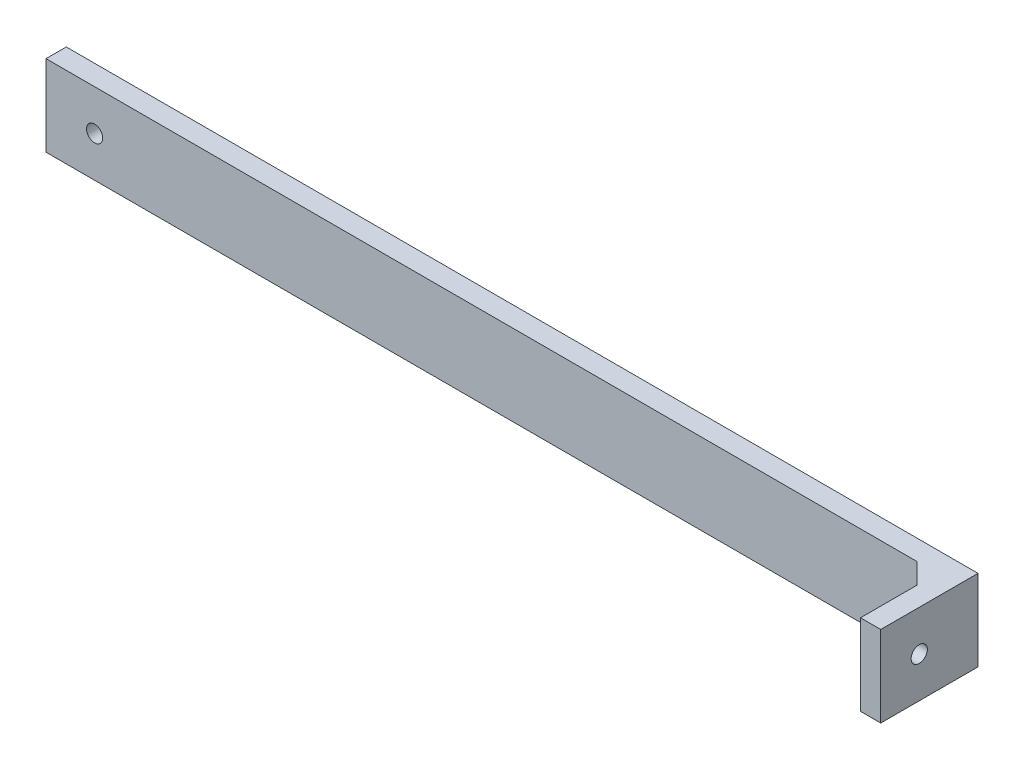
ISO-10303-21;
HEADER;
FILE_DESCRIPTION(('STEP AP214'),'2;1');
FILE_NAME('part.step','',(''),(''),'','','');
FILE_SCHEMA(('AUTOMOTIVE_DESIGN { 1 0 10303 214 1 1 1 1 }'));
ENDSEC;
DATA;
#1=APPLICATION_CONTEXT('core data for automotive mechanical design processes');
#2=APPLICATION_PROTOCOL_DEFINITION('international standard','automotive_design',2000,#1);
#3=PRODUCT_CONTEXT('',#1,'mechanical');
#4=PRODUCT('Part','Part','',(#3));
#5=PRODUCT_RELATED_PRODUCT_CATEGORY('part','',(#4));
#6=PRODUCT_DEFINITION_FORMATION('','',#4);
#7=PRODUCT_DEFINITION_CONTEXT('part definition',#1,'design');
#8=PRODUCT_DEFINITION('design','',#6,#7);
#9=PRODUCT_DEFINITION_SHAPE('','',#8);
#10=(LENGTH_UNIT() NAMED_UNIT(*) SI_UNIT(.MILLI.,.METRE.));
#11=(NAMED_UNIT(*) PLANE_ANGLE_UNIT() SI_UNIT($,.RADIAN.));
#12=(NAMED_UNIT(*) SI_UNIT($,.STERADIAN.) SOLID_ANGLE_UNIT());
#13=UNCERTAINTY_MEASURE_WITH_UNIT(LENGTH_MEASURE(1.E-05),#10,'distance_accuracy_value','');
#14=(GEOMETRIC_REPRESENTATION_CONTEXT(3) GLOBAL_UNCERTAINTY_ASSIGNED_CONTEXT((#13)) GLOBAL_UNIT_ASSIGNED_CONTEXT((#10,
#11,#12)) REPRESENTATION_CONTEXT('',''));
#15=CARTESIAN_POINT('',(0.,0.,0.));
#16=DIRECTION('',(0.,0.,1.));
#17=DIRECTION('',(1.,0.,0.));
#18=AXIS2_PLACEMENT_3D('',#15,#16,#17);
#19=CARTESIAN_POINT('',(0.,0.,5.));
#20=DIRECTION('',(0.,0.,-1.));
#21=DIRECTION('',(-1.,0.,0.));
#22=AXIS2_PLACEMENT_3D('',#19,#20,#21);
#23=PLANE('',#22);
#24=CARTESIAN_POINT('',(-100.5,0.,5.));
#25=DIRECTION('',(0.,0.,-1.));
#26=DIRECTION('',(-1.,0.,0.));
#27=AXIS2_PLACEMENT_3D('',#24,#25,#26);
#28=CIRCLE('',#27,2.);
#29=CARTESIAN_POINT('',(-102.5,0.,5.));
#30=VERTEX_POINT('',#29);
#31=EDGE_CURVE('E355',#30,#30,#28,.T.);
#32=ORIENTED_EDGE('',*,*,#31,.T.);
#33=EDGE_LOOP('',(#32));
#34=FACE_BOUND('',#33,.T.);
#35=DIRECTION('',(1.,0.,0.));
#36=VECTOR('',#35,1.);
#37=CARTESIAN_POINT('',(102.5,5.,5.));
#38=LINE('',#37,#36);
#39=CARTESIAN_POINT('',(102.5,5.,5.));
#40=VERTEX_POINT('',#39);
#41=CARTESIAN_POINT('',(107.5,5.,5.));
#42=VERTEX_POINT('',#41);
#43=EDGE_CURVE('E201',#40,#42,#38,.T.);
#44=ORIENTED_EDGE('',*,*,#43,.F.);
#45=DIRECTION('',(0.,-1.,0.));
#46=VECTOR('',#45,1.);
#47=CARTESIAN_POINT('',(102.5,10.,5.));
#48=LINE('',#47,#46);
#49=CARTESIAN_POINT('',(102.5,10.,5.));
#50=VERTEX_POINT('',#49);
#51=EDGE_CURVE('E118',#50,#40,#48,.T.);
#52=ORIENTED_EDGE('',*,*,#51,.F.);
#53=DIRECTION('',(-1.,0.,0.));
#54=VECTOR('',#53,1.);
#55=CARTESIAN_POINT('',(-112.5,10.,5.));
#56=LINE('',#55,#54);
#57=CARTESIAN_POINT('',(-112.5,10.,5.));
#58=VERTEX_POINT('',#57);
#59=EDGE_CURVE('E128',#50,#58,#56,.T.);
#60=ORIENTED_EDGE('',*,*,#59,.T.);
#61=DIRECTION('',(0.,-1.,0.));
#62=VECTOR('',#61,1.);
#63=CARTESIAN_POINT('',(-112.5,-10.,5.));
#64=LINE('',#63,#62);
#65=CARTESIAN_POINT('',(-112.5,-10.,5.));
#66=VERTEX_POINT('',#65);
#67=EDGE_CURVE('E148',#58,#66,#64,.T.);
#68=ORIENTED_EDGE('',*,*,#67,.T.);
#69=DIRECTION('',(1.,0.,0.));
#70=VECTOR('',#69,1.);
#71=CARTESIAN_POINT('',(-112.5,-10.,5.));
#72=LINE('',#71,#70);
#73=CARTESIAN_POINT('',(102.5,-10.,5.));
#74=VERTEX_POINT('',#73);
#75=EDGE_CURVE('E151',#66,#74,#72,.T.);
#76=ORIENTED_EDGE('',*,*,#75,.T.);
#77=DIRECTION('',(0.,-1.,0.));
#78=VECTOR('',#77,1.);
#79=CARTESIAN_POINT('',(102.5,-10.,5.));
#80=LINE('',#79,#78);
#81=CARTESIAN_POINT('',(102.5,-5.,5.));
#82=VERTEX_POINT('',#81);
#83=EDGE_CURVE('E203',#82,#74,#80,.T.);
#84=ORIENTED_EDGE('',*,*,#83,.F.);
#85=DIRECTION('',(1.,0.,0.));
#86=VECTOR('',#85,1.);
#87=CARTESIAN_POINT('',(102.5,-5.,5.));
#88=LINE('',#87,#86);
#89=CARTESIAN_POINT('',(107.5,-5.,5.));
#90=VERTEX_POINT('',#89);
#91=EDGE_CURVE('E208',#82,#90,#88,.T.);
#92=ORIENTED_EDGE('',*,*,#91,.T.);
#93=DIRECTION('',(0.,-1.,0.));
#94=VECTOR('',#93,1.);
#95=CARTESIAN_POINT('',(107.5,10.,5.));
#96=LINE('',#95,#94);
#97=EDGE_CURVE('E185',#42,#90,#96,.T.);
#98=ORIENTED_EDGE('',*,*,#97,.F.);
#99=EDGE_LOOP('',(#44,#52,#60,#68,#76,#84,#92,#98));
#100=FACE_BOUND('',#99,.T.);
#101=ADVANCED_FACE('F37',(#34,#100),#23,.F.);
#102=CARTESIAN_POINT('',(107.5,10.,24.));
#103=DIRECTION('',(1.,0.,0.));
#104=DIRECTION('',(0.,0.,-1.));
#105=AXIS2_PLACEMENT_3D('',#102,#103,#104);
#106=PLANE('',#105);
#107=DIRECTION('',(0.,0.,-1.));
#108=VECTOR('',#107,1.);
#109=CARTESIAN_POINT('',(107.5,-5.,5.));
#110=LINE('',#109,#108);
#111=CARTESIAN_POINT('',(107.5,-5.,10.));
#112=VERTEX_POINT('',#111);
#113=EDGE_CURVE('E198',#112,#90,#110,.T.);
#114=ORIENTED_EDGE('',*,*,#113,.F.);
#115=DIRECTION('',(0.,1.,0.));
#116=VECTOR('',#115,1.);
#117=CARTESIAN_POINT('',(107.5,-10.,10.));
#118=LINE('',#117,#116);
#119=CARTESIAN_POINT('',(107.5,-10.,10.));
#120=VERTEX_POINT('',#119);
#121=EDGE_CURVE('E196',#120,#112,#118,.T.);
#122=ORIENTED_EDGE('',*,*,#121,.F.);
#123=DIRECTION('',(0.,0.,-1.));
#124=VECTOR('',#123,1.);
#125=CARTESIAN_POINT('',(107.5,-10.,24.));
#126=LINE('',#125,#124);
#127=CARTESIAN_POINT('',(107.5,-10.,24.));
#128=VERTEX_POINT('',#127);
#129=EDGE_CURVE('E137',#128,#120,#126,.T.);
#130=ORIENTED_EDGE('',*,*,#129,.F.);
#131=DIRECTION('',(0.,-1.,0.));
#132=VECTOR('',#131,1.);
#133=CARTESIAN_POINT('',(107.5,10.,24.));
#134=LINE('',#133,#132);
#135=CARTESIAN_POINT('',(107.5,10.,24.));
#136=VERTEX_POINT('',#135);
#137=EDGE_CURVE('E135',#136,#128,#134,.T.);
#138=ORIENTED_EDGE('',*,*,#137,.F.);
#139=DIRECTION('',(0.,0.,-1.));
#140=VECTOR('',#139,1.);
#141=CARTESIAN_POINT('',(107.5,10.,24.));
#142=LINE('',#141,#140);
#143=CARTESIAN_POINT('',(107.5,10.,10.));
#144=VERTEX_POINT('',#143);
#145=EDGE_CURVE('E125',#136,#144,#142,.T.);
#146=ORIENTED_EDGE('',*,*,#145,.T.);
#147=DIRECTION('',(0.,1.,0.));
#148=VECTOR('',#147,1.);
#149=CARTESIAN_POINT('',(107.5,10.,10.));
#150=LINE('',#149,#148);
#151=CARTESIAN_POINT('',(107.5,5.,10.));
#152=VERTEX_POINT('',#151);
#153=EDGE_CURVE('E113',#152,#144,#150,.T.);
#154=ORIENTED_EDGE('',*,*,#153,.F.);
#155=DIRECTION('',(0.,0.,1.));
#156=VECTOR('',#155,1.);
#157=CARTESIAN_POINT('',(107.5,5.,5.));
#158=LINE('',#157,#156);
#159=EDGE_CURVE('E53',#42,#152,#158,.T.);
#160=ORIENTED_EDGE('',*,*,#159,.F.);
#161=ORIENTED_EDGE('',*,*,#97,.T.);
#162=EDGE_LOOP('',(#114,#122,#130,#138,#146,#154,#160,#161));
#163=FACE_BOUND('',#162,.T.);
#164=CARTESIAN_POINT('',(107.5,0.,14.5));
#165=DIRECTION('',(1.,0.,0.));
#166=DIRECTION('',(0.,0.,-1.));
#167=AXIS2_PLACEMENT_3D('',#164,#165,#166);
#168=CIRCLE('',#167,2.);
#169=CARTESIAN_POINT('',(107.5,0.,12.5));
#170=VERTEX_POINT('',#169);
#171=EDGE_CURVE('E41',#170,#170,#168,.T.);
#172=ORIENTED_EDGE('',*,*,#171,.T.);
#173=EDGE_LOOP('',(#172));
#174=FACE_BOUND('',#173,.T.);
#175=ADVANCED_FACE('F132',(#163,#174),#106,.F.);
#176=CARTESIAN_POINT('',(112.5,-10.,5.));
#177=DIRECTION('',(-1.,0.,0.));
#178=DIRECTION('',(0.,0.,1.));
#179=AXIS2_PLACEMENT_3D('',#176,#177,#178);
#180=PLANE('',#179);
#181=CARTESIAN_POINT('',(112.5,0.,14.5));
#182=DIRECTION('',(1.,0.,0.));
#183=DIRECTION('',(0.,0.,-1.));
#184=AXIS2_PLACEMENT_3D('',#181,#182,#183);
#185=CIRCLE('',#184,2.);
#186=CARTESIAN_POINT('',(112.5,0.,12.5));
#187=VERTEX_POINT('',#186);
#188=EDGE_CURVE('E189',#187,#187,#185,.T.);
#189=ORIENTED_EDGE('',*,*,#188,.F.);
#190=EDGE_LOOP('',(#189));
#191=FACE_BOUND('',#190,.T.);
#192=DIRECTION('',(0.,1.,0.));
#193=VECTOR('',#192,1.);
#194=CARTESIAN_POINT('',(112.5,-10.,0.));
#195=LINE('',#194,#193);
#196=CARTESIAN_POINT('',(112.5,-10.,0.));
#197=VERTEX_POINT('',#196);
#198=CARTESIAN_POINT('',(112.5,10.,0.));
#199=VERTEX_POINT('',#198);
#200=EDGE_CURVE('E136',#197,#199,#195,.T.);
#201=ORIENTED_EDGE('',*,*,#200,.T.);
#202=DIRECTION('',(0.,0.,-1.));
#203=VECTOR('',#202,1.);
#204=CARTESIAN_POINT('',(112.5,10.,5.));
#205=LINE('',#204,#203);
#206=CARTESIAN_POINT('',(112.5,10.,24.));
#207=VERTEX_POINT('',#206);
#208=EDGE_CURVE('E11',#207,#199,#205,.T.);
#209=ORIENTED_EDGE('',*,*,#208,.F.);
#210=DIRECTION('',(0.,1.,0.));
#211=VECTOR('',#210,1.);
#212=CARTESIAN_POINT('',(112.5,10.,24.));
#213=LINE('',#212,#211);
#214=CARTESIAN_POINT('',(112.5,-10.,24.));
#215=VERTEX_POINT('',#214);
#216=EDGE_CURVE('E182',#215,#207,#213,.T.);
#217=ORIENTED_EDGE('',*,*,#216,.F.);
#218=DIRECTION('',(0.,0.,-1.));
#219=VECTOR('',#218,1.);
#220=CARTESIAN_POINT('',(112.5,-10.,5.));
#221=LINE('',#220,#219);
#222=EDGE_CURVE('E153',#215,#197,#221,.T.);
#223=ORIENTED_EDGE('',*,*,#222,.T.);
#224=EDGE_LOOP('',(#201,#209,#217,#223));
#225=FACE_BOUND('',#224,.T.);
#226=ADVANCED_FACE('F39',(#191,#225),#180,.F.);
#227=CARTESIAN_POINT('',(-112.5,10.,5.));
#228=DIRECTION('',(0.,-1.,0.));
#229=DIRECTION('',(0.,0.,-1.));
#230=AXIS2_PLACEMENT_3D('',#227,#228,#229);
#231=PLANE('',#230);
#232=ORIENTED_EDGE('',*,*,#59,.F.);
#233=DIRECTION('',(0.707106781186548,0.,0.707106781186547));
#234=VECTOR('',#233,1.);
#235=CARTESIAN_POINT('',(102.5,10.,5.));
#236=LINE('',#235,#234);
#237=EDGE_CURVE('E61',#50,#144,#236,.T.);
#238=ORIENTED_EDGE('',*,*,#237,.T.);
#239=ORIENTED_EDGE('',*,*,#145,.F.);
#240=DIRECTION('',(-1.,0.,0.));
#241=VECTOR('',#240,1.);
#242=CARTESIAN_POINT('',(112.5,10.,24.));
#243=LINE('',#242,#241);
#244=EDGE_CURVE('E184',#207,#136,#243,.T.);
#245=ORIENTED_EDGE('',*,*,#244,.F.);
#246=ORIENTED_EDGE('',*,*,#208,.T.);
#247=DIRECTION('',(-1.,0.,0.));
#248=VECTOR('',#247,1.);
#249=CARTESIAN_POINT('',(-112.5,10.,0.));
#250=LINE('',#249,#248);
#251=CARTESIAN_POINT('',(-112.5,10.,0.));
#252=VERTEX_POINT('',#251);
#253=EDGE_CURVE('E140',#199,#252,#250,.T.);
#254=ORIENTED_EDGE('',*,*,#253,.T.);
#255=DIRECTION('',(0.,0.,-1.));
#256=VECTOR('',#255,1.);
#257=CARTESIAN_POINT('',(-112.5,10.,5.));
#258=LINE('',#257,#256);
#259=EDGE_CURVE('E46',#58,#252,#258,.T.);
#260=ORIENTED_EDGE('',*,*,#259,.F.);
#261=EDGE_LOOP('',(#232,#238,#239,#245,#246,#254,#260));
#262=FACE_BOUND('',#261,.T.);
#263=ADVANCED_FACE('F123',(#262),#231,.F.);
#264=CARTESIAN_POINT('',(-112.5,-10.,5.));
#265=DIRECTION('',(1.,0.,0.));
#266=DIRECTION('',(0.,0.,-1.));
#267=AXIS2_PLACEMENT_3D('',#264,#265,#266);
#268=PLANE('',#267);
#269=DIRECTION('',(0.,-1.,0.));
#270=VECTOR('',#269,1.);
#271=CARTESIAN_POINT('',(-112.5,-10.,0.));
#272=LINE('',#271,#270);
#273=CARTESIAN_POINT('',(-112.5,-10.,0.));
#274=VERTEX_POINT('',#273);
#275=EDGE_CURVE('E156',#252,#274,#272,.T.);
#276=ORIENTED_EDGE('',*,*,#275,.T.);
#277=DIRECTION('',(0.,0.,-1.));
#278=VECTOR('',#277,1.);
#279=CARTESIAN_POINT('',(-112.5,-10.,5.));
#280=LINE('',#279,#278);
#281=EDGE_CURVE('E161',#66,#274,#280,.T.);
#282=ORIENTED_EDGE('',*,*,#281,.F.);
#283=ORIENTED_EDGE('',*,*,#67,.F.);
#284=ORIENTED_EDGE('',*,*,#259,.T.);
#285=EDGE_LOOP('',(#276,#282,#283,#284));
#286=FACE_BOUND('',#285,.T.);
#287=ADVANCED_FACE('F168',(#286),#268,.F.);
#288=CARTESIAN_POINT('',(-112.5,-10.,5.));
#289=DIRECTION('',(0.,1.,0.));
#290=DIRECTION('',(0.,0.,1.));
#291=AXIS2_PLACEMENT_3D('',#288,#289,#290);
#292=PLANE('',#291);
#293=ORIENTED_EDGE('',*,*,#129,.T.);
#294=DIRECTION('',(0.707106781186548,0.,0.707106781186547));
#295=VECTOR('',#294,1.);
#296=CARTESIAN_POINT('',(102.5,-10.,5.));
#297=LINE('',#296,#295);
#298=EDGE_CURVE('E129',#74,#120,#297,.T.);
#299=ORIENTED_EDGE('',*,*,#298,.F.);
#300=ORIENTED_EDGE('',*,*,#75,.F.);
#301=ORIENTED_EDGE('',*,*,#281,.T.);
#302=DIRECTION('',(1.,0.,0.));
#303=VECTOR('',#302,1.);
#304=CARTESIAN_POINT('',(-112.5,-10.,0.));
#305=LINE('',#304,#303);
#306=EDGE_CURVE('E149',#274,#197,#305,.T.);
#307=ORIENTED_EDGE('',*,*,#306,.T.);
#308=ORIENTED_EDGE('',*,*,#222,.F.);
#309=DIRECTION('',(1.,0.,0.));
#310=VECTOR('',#309,1.);
#311=CARTESIAN_POINT('',(112.5,-10.,24.));
#312=LINE('',#311,#310);
#313=EDGE_CURVE('E143',#128,#215,#312,.T.);
#314=ORIENTED_EDGE('',*,*,#313,.F.);
#315=EDGE_LOOP('',(#293,#299,#300,#301,#307,#308,#314));
#316=FACE_BOUND('',#315,.T.);
#317=ADVANCED_FACE('F175',(#316),#292,.F.);
#318=CARTESIAN_POINT('',(0.,0.,0.));
#319=DIRECTION('',(0.,0.,-1.));
#320=DIRECTION('',(-1.,0.,0.));
#321=AXIS2_PLACEMENT_3D('',#318,#319,#320);
#322=PLANE('',#321);
#323=CARTESIAN_POINT('',(-100.5,0.,0.));
#324=DIRECTION('',(0.,0.,-1.));
#325=DIRECTION('',(-1.,0.,0.));
#326=AXIS2_PLACEMENT_3D('',#323,#324,#325);
#327=CIRCLE('',#326,2.);
#328=CARTESIAN_POINT('',(-102.5,0.,0.));
#329=VERTEX_POINT('',#328);
#330=EDGE_CURVE('E353',#329,#329,#327,.T.);
#331=ORIENTED_EDGE('',*,*,#330,.F.);
#332=EDGE_LOOP('',(#331));
#333=FACE_BOUND('',#332,.T.);
#334=ORIENTED_EDGE('',*,*,#200,.F.);
#335=ORIENTED_EDGE('',*,*,#306,.F.);
#336=ORIENTED_EDGE('',*,*,#275,.F.);
#337=ORIENTED_EDGE('',*,*,#253,.F.);
#338=EDGE_LOOP('',(#334,#335,#336,#337));
#339=FACE_BOUND('',#338,.T.);
#340=ADVANCED_FACE('F173',(#333,#339),#322,.T.);
#341=CARTESIAN_POINT('',(0.,0.,24.));
#342=DIRECTION('',(0.,0.,-1.));
#343=DIRECTION('',(-1.,0.,0.));
#344=AXIS2_PLACEMENT_3D('',#341,#342,#343);
#345=PLANE('',#344);
#346=ORIENTED_EDGE('',*,*,#216,.T.);
#347=ORIENTED_EDGE('',*,*,#244,.T.);
#348=ORIENTED_EDGE('',*,*,#137,.T.);
#349=ORIENTED_EDGE('',*,*,#313,.T.);
#350=EDGE_LOOP('',(#346,#347,#348,#349));
#351=FACE_BOUND('',#350,.T.);
#352=ADVANCED_FACE('F193',(#351),#345,.F.);
#353=CARTESIAN_POINT('',(-112.5,0.,14.5));
#354=DIRECTION('',(1.,0.,0.));
#355=DIRECTION('',(0.,0.,-1.));
#356=AXIS2_PLACEMENT_3D('',#353,#354,#355);
#357=CYLINDRICAL_SURFACE('',#356,2.);
#358=ORIENTED_EDGE('',*,*,#188,.T.);
#359=EDGE_LOOP('',(#358));
#360=FACE_BOUND('',#359,.T.);
#361=ORIENTED_EDGE('',*,*,#171,.F.);
#362=EDGE_LOOP('',(#361));
#363=FACE_BOUND('',#362,.T.);
#364=ADVANCED_FACE('F233',(#360,#363),#357,.F.);
#365=CARTESIAN_POINT('',(102.5,-5.,5.));
#366=DIRECTION('',(0.,-1.,0.));
#367=DIRECTION('',(0.,0.,-1.));
#368=AXIS2_PLACEMENT_3D('',#365,#366,#367);
#369=PLANE('',#368);
#370=ORIENTED_EDGE('',*,*,#91,.F.);
#371=DIRECTION('',(0.707106781186548,0.,0.707106781186547));
#372=VECTOR('',#371,1.);
#373=CARTESIAN_POINT('',(102.5,-5.,5.));
#374=LINE('',#373,#372);
#375=EDGE_CURVE('E215',#82,#112,#374,.T.);
#376=ORIENTED_EDGE('',*,*,#375,.T.);
#377=ORIENTED_EDGE('',*,*,#113,.T.);
#378=EDGE_LOOP('',(#370,#376,#377));
#379=FACE_BOUND('',#378,.T.);
#380=ADVANCED_FACE('F218',(#379),#369,.F.);
#381=CARTESIAN_POINT('',(102.5,5.,5.));
#382=DIRECTION('',(0.,1.,0.));
#383=DIRECTION('',(0.,0.,1.));
#384=AXIS2_PLACEMENT_3D('',#381,#382,#383);
#385=PLANE('',#384);
#386=ORIENTED_EDGE('',*,*,#159,.T.);
#387=DIRECTION('',(-0.707106781186548,0.,-0.707106781186547));
#388=VECTOR('',#387,1.);
#389=CARTESIAN_POINT('',(102.5,5.,5.));
#390=LINE('',#389,#388);
#391=EDGE_CURVE('E116',#152,#40,#390,.T.);
#392=ORIENTED_EDGE('',*,*,#391,.T.);
#393=ORIENTED_EDGE('',*,*,#43,.T.);
#394=EDGE_LOOP('',(#386,#392,#393));
#395=FACE_BOUND('',#394,.T.);
#396=ADVANCED_FACE('F225',(#395),#385,.F.);
#397=CARTESIAN_POINT('',(102.5,10.,5.));
#398=DIRECTION('',(0.707106781186547,0.,-0.707106781186548));
#399=DIRECTION('',(-0.707106781186548,0.,-0.707106781186547));
#400=AXIS2_PLACEMENT_3D('',#397,#398,#399);
#401=PLANE('',#400);
#402=ORIENTED_EDGE('',*,*,#153,.T.);
#403=ORIENTED_EDGE('',*,*,#237,.F.);
#404=ORIENTED_EDGE('',*,*,#51,.T.);
#405=ORIENTED_EDGE('',*,*,#391,.F.);
#406=EDGE_LOOP('',(#402,#403,#404,#405));
#407=FACE_BOUND('',#406,.T.);
#408=ADVANCED_FACE('F114',(#407),#401,.F.);
#409=ORIENTED_EDGE('',*,*,#83,.T.);
#410=ORIENTED_EDGE('',*,*,#298,.T.);
#411=ORIENTED_EDGE('',*,*,#121,.T.);
#412=ORIENTED_EDGE('',*,*,#375,.F.);
#413=EDGE_LOOP('',(#409,#410,#411,#412));
#414=FACE_BOUND('',#413,.T.);
#415=ADVANCED_FACE('F214',(#414),#401,.F.);
#416=CARTESIAN_POINT('',(-100.5,0.,24.));
#417=DIRECTION('',(0.,0.,-1.));
#418=DIRECTION('',(-1.,0.,0.));
#419=AXIS2_PLACEMENT_3D('',#416,#417,#418);
#420=CYLINDRICAL_SURFACE('',#419,2.);
#421=ORIENTED_EDGE('',*,*,#330,.T.);
#422=EDGE_LOOP('',(#421));
#423=FACE_BOUND('',#422,.T.);
#424=ORIENTED_EDGE('',*,*,#31,.F.);
#425=EDGE_LOOP('',(#424));
#426=FACE_BOUND('',#425,.T.);
#427=ADVANCED_FACE('F339',(#423,#426),#420,.F.);
#428=CLOSED_SHELL('',(#101,#175,#226,#263,#287,#317,#340,#352,#364,#380,#396,#408,#415,#427));
#429=MANIFOLD_SOLID_BREP('B2',#428);
#430=ADVANCED_BREP_SHAPE_REPRESENTATION('',(#18,#429),#14);
#431=SHAPE_DEFINITION_REPRESENTATION(#9,#430);
ENDSEC;
END-ISO-10303-21;
